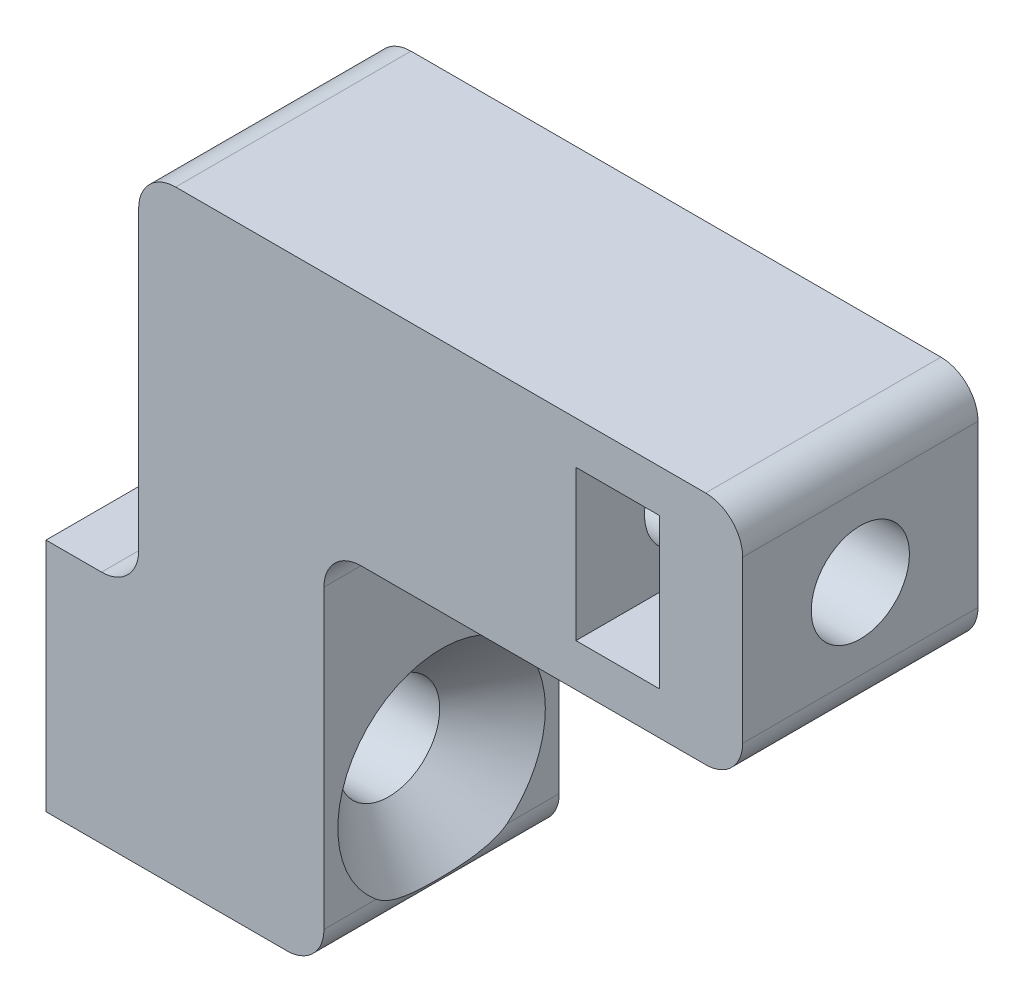
ISO-10303-21;
HEADER;
FILE_DESCRIPTION(('STEP AP214'),'2;1');
FILE_NAME('part.step','',(''),(''),'','','');
FILE_SCHEMA(('AUTOMOTIVE_DESIGN { 1 0 10303 214 1 1 1 1 }'));
ENDSEC;
DATA;
#1=APPLICATION_CONTEXT('core data for automotive mechanical design processes');
#2=APPLICATION_PROTOCOL_DEFINITION('international standard','automotive_design',2000,#1);
#3=PRODUCT_CONTEXT('',#1,'mechanical');
#4=PRODUCT('Part','Part','',(#3));
#5=PRODUCT_RELATED_PRODUCT_CATEGORY('part','',(#4));
#6=PRODUCT_DEFINITION_FORMATION('','',#4);
#7=PRODUCT_DEFINITION_CONTEXT('part definition',#1,'design');
#8=PRODUCT_DEFINITION('design','',#6,#7);
#9=PRODUCT_DEFINITION_SHAPE('','',#8);
#10=(LENGTH_UNIT() NAMED_UNIT(*) SI_UNIT(.MILLI.,.METRE.));
#11=(NAMED_UNIT(*) PLANE_ANGLE_UNIT() SI_UNIT($,.RADIAN.));
#12=(NAMED_UNIT(*) SI_UNIT($,.STERADIAN.) SOLID_ANGLE_UNIT());
#13=UNCERTAINTY_MEASURE_WITH_UNIT(LENGTH_MEASURE(1.E-05),#10,'distance_accuracy_value','');
#14=(GEOMETRIC_REPRESENTATION_CONTEXT(3) GLOBAL_UNCERTAINTY_ASSIGNED_CONTEXT((#13)) GLOBAL_UNIT_ASSIGNED_CONTEXT((#10,
#11,#12)) REPRESENTATION_CONTEXT('',''));
#15=CARTESIAN_POINT('',(0.,0.,0.));
#16=DIRECTION('',(0.,0.,1.));
#17=DIRECTION('',(1.,0.,0.));
#18=AXIS2_PLACEMENT_3D('',#15,#16,#17);
#19=CARTESIAN_POINT('',(0.,0.,12.7));
#20=DIRECTION('',(0.,0.,1.));
#21=DIRECTION('',(1.,0.,0.));
#22=AXIS2_PLACEMENT_3D('',#19,#20,#21);
#23=PLANE('',#22);
#24=DIRECTION('',(0.,1.,0.));
#25=VECTOR('',#24,1.);
#26=CARTESIAN_POINT('',(37.6,-6.35,12.7));
#27=LINE('',#26,#25);
#28=CARTESIAN_POINT('',(37.6,-4.35,12.7));
#29=VERTEX_POINT('',#28);
#30=CARTESIAN_POINT('',(37.6,4.35,12.7));
#31=VERTEX_POINT('',#30);
#32=EDGE_CURVE('E246',#29,#31,#27,.T.);
#33=ORIENTED_EDGE('',*,*,#32,.T.);
#34=CARTESIAN_POINT('',(35.6,4.35,12.7));
#35=DIRECTION('',(0.,0.,1.));
#36=DIRECTION('',(1.,0.,0.));
#37=AXIS2_PLACEMENT_3D('',#34,#35,#36);
#38=CIRCLE('',#37,2.);
#39=CARTESIAN_POINT('',(35.6,6.35,12.7));
#40=VERTEX_POINT('',#39);
#41=EDGE_CURVE('E309',#31,#40,#38,.T.);
#42=ORIENTED_EDGE('',*,*,#41,.T.);
#43=DIRECTION('',(-1.,0.,0.));
#44=VECTOR('',#43,1.);
#45=CARTESIAN_POINT('',(5.,6.35,12.7));
#46=LINE('',#45,#44);
#47=CARTESIAN_POINT('',(7.,6.35,12.7));
#48=VERTEX_POINT('',#47);
#49=EDGE_CURVE('E249',#40,#48,#46,.T.);
#50=ORIENTED_EDGE('',*,*,#49,.T.);
#51=CARTESIAN_POINT('',(7.,4.35,12.7));
#52=DIRECTION('',(0.,0.,1.));
#53=DIRECTION('',(1.,0.,0.));
#54=AXIS2_PLACEMENT_3D('',#51,#52,#53);
#55=CIRCLE('',#54,2.);
#56=CARTESIAN_POINT('',(5.,4.35,12.7));
#57=VERTEX_POINT('',#56);
#58=EDGE_CURVE('E305',#48,#57,#55,.T.);
#59=ORIENTED_EDGE('',*,*,#58,.T.);
#60=DIRECTION('',(0.,-1.,0.));
#61=VECTOR('',#60,1.);
#62=CARTESIAN_POINT('',(5.,-13.65,12.7));
#63=LINE('',#62,#61);
#64=CARTESIAN_POINT('',(5.,-11.65,12.7));
#65=VERTEX_POINT('',#64);
#66=EDGE_CURVE('E252',#57,#65,#63,.T.);
#67=ORIENTED_EDGE('',*,*,#66,.T.);
#68=CARTESIAN_POINT('',(3.,-11.65,12.7));
#69=DIRECTION('',(0.,0.,1.));
#70=DIRECTION('',(1.,0.,0.));
#71=AXIS2_PLACEMENT_3D('',#68,#69,#70);
#72=CIRCLE('',#71,2.);
#73=CARTESIAN_POINT('',(3.,-13.65,12.7));
#74=VERTEX_POINT('',#73);
#75=EDGE_CURVE('E47',#65,#74,#72,.F.);
#76=ORIENTED_EDGE('',*,*,#75,.T.);
#77=DIRECTION('',(-1.,0.,0.));
#78=VECTOR('',#77,1.);
#79=CARTESIAN_POINT('',(0.,-13.65,12.7));
#80=LINE('',#79,#78);
#81=CARTESIAN_POINT('',(0.,-13.65,12.7));
#82=VERTEX_POINT('',#81);
#83=EDGE_CURVE('E255',#74,#82,#80,.T.);
#84=ORIENTED_EDGE('',*,*,#83,.T.);
#85=DIRECTION('',(0.,-1.,0.));
#86=VECTOR('',#85,1.);
#87=CARTESIAN_POINT('',(0.,-26.35,12.7));
#88=LINE('',#87,#86);
#89=CARTESIAN_POINT('',(0.,-26.35,12.7));
#90=VERTEX_POINT('',#89);
#91=EDGE_CURVE('E257',#82,#90,#88,.T.);
#92=ORIENTED_EDGE('',*,*,#91,.T.);
#93=DIRECTION('',(1.,0.,0.));
#94=VECTOR('',#93,1.);
#95=CARTESIAN_POINT('',(0.,-26.35,12.7));
#96=LINE('',#95,#94);
#97=CARTESIAN_POINT('',(13.,-26.35,12.7));
#98=VERTEX_POINT('',#97);
#99=EDGE_CURVE('E236',#90,#98,#96,.T.);
#100=ORIENTED_EDGE('',*,*,#99,.T.);
#101=CARTESIAN_POINT('',(13.,-24.35,12.7));
#102=DIRECTION('',(0.,0.,1.));
#103=DIRECTION('',(1.,0.,0.));
#104=AXIS2_PLACEMENT_3D('',#101,#102,#103);
#105=CIRCLE('',#104,2.);
#106=CARTESIAN_POINT('',(15.,-24.35,12.7));
#107=VERTEX_POINT('',#106);
#108=EDGE_CURVE('E303',#98,#107,#105,.T.);
#109=ORIENTED_EDGE('',*,*,#108,.T.);
#110=DIRECTION('',(0.,1.,0.));
#111=VECTOR('',#110,1.);
#112=CARTESIAN_POINT('',(15.,-26.35,12.7));
#113=LINE('',#112,#111);
#114=CARTESIAN_POINT('',(15.,-8.35,12.7));
#115=VERTEX_POINT('',#114);
#116=EDGE_CURVE('E239',#107,#115,#113,.T.);
#117=ORIENTED_EDGE('',*,*,#116,.T.);
#118=CARTESIAN_POINT('',(17.,-8.35,12.7));
#119=DIRECTION('',(0.,0.,1.));
#120=DIRECTION('',(1.,0.,0.));
#121=AXIS2_PLACEMENT_3D('',#118,#119,#120);
#122=CIRCLE('',#121,2.);
#123=CARTESIAN_POINT('',(17.,-6.35,12.7));
#124=VERTEX_POINT('',#123);
#125=EDGE_CURVE('E334',#115,#124,#122,.F.);
#126=ORIENTED_EDGE('',*,*,#125,.T.);
#127=DIRECTION('',(1.,0.,0.));
#128=VECTOR('',#127,1.);
#129=CARTESIAN_POINT('',(15.,-6.35,12.7));
#130=LINE('',#129,#128);
#131=CARTESIAN_POINT('',(35.6,-6.35,12.7));
#132=VERTEX_POINT('',#131);
#133=EDGE_CURVE('E243',#124,#132,#130,.T.);
#134=ORIENTED_EDGE('',*,*,#133,.T.);
#135=CARTESIAN_POINT('',(35.6,-4.35,12.7));
#136=DIRECTION('',(0.,0.,1.));
#137=DIRECTION('',(1.,0.,0.));
#138=AXIS2_PLACEMENT_3D('',#135,#136,#137);
#139=CIRCLE('',#138,2.);
#140=EDGE_CURVE('E307',#132,#29,#139,.T.);
#141=ORIENTED_EDGE('',*,*,#140,.T.);
#142=EDGE_LOOP('',(#33,#42,#50,#59,#67,#76,#84,#92,#100,#109,#117,#126,#134,#141));
#143=FACE_BOUND('',#142,.T.);
#144=DIRECTION('',(-1.,0.,0.));
#145=VECTOR('',#144,1.);
#146=CARTESIAN_POINT('',(33.1,4.05,12.7));
#147=LINE('',#146,#145);
#148=CARTESIAN_POINT('',(33.1,4.05,12.7));
#149=VERTEX_POINT('',#148);
#150=CARTESIAN_POINT('',(28.6,4.05,12.7));
#151=VERTEX_POINT('',#150);
#152=EDGE_CURVE('E55',#149,#151,#147,.T.);
#153=ORIENTED_EDGE('',*,*,#152,.F.);
#154=DIRECTION('',(0.,-1.,0.));
#155=VECTOR('',#154,1.);
#156=CARTESIAN_POINT('',(33.1,-4.05000000000002,12.7));
#157=LINE('',#156,#155);
#158=CARTESIAN_POINT('',(33.1,-4.05000000000002,12.7));
#159=VERTEX_POINT('',#158);
#160=EDGE_CURVE('E182',#149,#159,#157,.T.);
#161=ORIENTED_EDGE('',*,*,#160,.T.);
#162=DIRECTION('',(-1.,0.,0.));
#163=VECTOR('',#162,1.);
#164=CARTESIAN_POINT('',(33.1,-4.05000000000002,12.7));
#165=LINE('',#164,#163);
#166=CARTESIAN_POINT('',(28.6,-4.05000000000002,12.7));
#167=VERTEX_POINT('',#166);
#168=EDGE_CURVE('E190',#159,#167,#165,.T.);
#169=ORIENTED_EDGE('',*,*,#168,.T.);
#170=DIRECTION('',(0.,-1.,0.));
#171=VECTOR('',#170,1.);
#172=CARTESIAN_POINT('',(28.6,-4.05000000000002,12.7));
#173=LINE('',#172,#171);
#174=EDGE_CURVE('E209',#151,#167,#173,.T.);
#175=ORIENTED_EDGE('',*,*,#174,.F.);
#176=EDGE_LOOP('',(#153,#161,#169,#175));
#177=FACE_BOUND('',#176,.T.);
#178=ADVANCED_FACE('F38',(#143,#177),#23,.T.);
#179=CARTESIAN_POINT('',(37.6,0.,6.35));
#180=DIRECTION('',(1.,0.,0.));
#181=DIRECTION('',(0.,0.,-1.));
#182=AXIS2_PLACEMENT_3D('',#179,#180,#181);
#183=CYLINDRICAL_SURFACE('',#182,2.65);
#184=CARTESIAN_POINT('',(37.6,0.,6.35));
#185=DIRECTION('',(1.,0.,0.));
#186=DIRECTION('',(0.,0.,-1.));
#187=AXIS2_PLACEMENT_3D('',#184,#185,#186);
#188=CIRCLE('',#187,2.65);
#189=CARTESIAN_POINT('',(37.6,0.,3.7));
#190=VERTEX_POINT('',#189);
#191=EDGE_CURVE('E224',#190,#190,#188,.T.);
#192=ORIENTED_EDGE('',*,*,#191,.T.);
#193=EDGE_LOOP('',(#192));
#194=FACE_BOUND('',#193,.T.);
#195=CARTESIAN_POINT('',(33.1,0.,6.35));
#196=DIRECTION('',(-1.,0.,0.));
#197=DIRECTION('',(0.,0.,1.));
#198=AXIS2_PLACEMENT_3D('',#195,#196,#197);
#199=CIRCLE('',#198,2.65);
#200=CARTESIAN_POINT('',(33.1,0.,9.));
#201=VERTEX_POINT('',#200);
#202=EDGE_CURVE('E42',#201,#201,#199,.F.);
#203=ORIENTED_EDGE('',*,*,#202,.F.);
#204=EDGE_LOOP('',(#203));
#205=FACE_BOUND('',#204,.T.);
#206=ADVANCED_FACE('F361',(#194,#205),#183,.F.);
#207=CARTESIAN_POINT('',(0.,-26.35,12.7));
#208=DIRECTION('',(0.,1.,0.));
#209=DIRECTION('',(0.,0.,1.));
#210=AXIS2_PLACEMENT_3D('',#207,#208,#209);
#211=PLANE('',#210);
#212=DIRECTION('',(1.,0.,0.));
#213=VECTOR('',#212,1.);
#214=CARTESIAN_POINT('',(0.,-26.35,0.));
#215=LINE('',#214,#213);
#216=CARTESIAN_POINT('',(0.,-26.35,0.));
#217=VERTEX_POINT('',#216);
#218=CARTESIAN_POINT('',(13.,-26.35,0.));
#219=VERTEX_POINT('',#218);
#220=EDGE_CURVE('E235',#217,#219,#215,.T.);
#221=ORIENTED_EDGE('',*,*,#220,.T.);
#222=DIRECTION('',(0.,0.,-1.));
#223=VECTOR('',#222,1.);
#224=CARTESIAN_POINT('',(13.,-26.35,12.7));
#225=LINE('',#224,#223);
#226=EDGE_CURVE('E327',#219,#98,#225,.F.);
#227=ORIENTED_EDGE('',*,*,#226,.T.);
#228=ORIENTED_EDGE('',*,*,#99,.F.);
#229=DIRECTION('',(0.,0.,-1.));
#230=VECTOR('',#229,1.);
#231=CARTESIAN_POINT('',(0.,-26.35,12.7));
#232=LINE('',#231,#230);
#233=EDGE_CURVE('E259',#90,#217,#232,.T.);
#234=ORIENTED_EDGE('',*,*,#233,.T.);
#235=EDGE_LOOP('',(#221,#227,#228,#234));
#236=FACE_BOUND('',#235,.T.);
#237=ADVANCED_FACE('F395',(#236),#211,.F.);
#238=CARTESIAN_POINT('',(15.,-26.35,12.7));
#239=DIRECTION('',(-1.,0.,0.));
#240=DIRECTION('',(0.,0.,1.));
#241=AXIS2_PLACEMENT_3D('',#238,#239,#240);
#242=PLANE('',#241);
#243=DIRECTION('',(0.,0.,-1.));
#244=VECTOR('',#243,1.);
#245=CARTESIAN_POINT('',(15.,-24.35,12.7));
#246=LINE('',#245,#244);
#247=CARTESIAN_POINT('',(15.,-24.35,9.87668399491647));
#248=VERTEX_POINT('',#247);
#249=EDGE_CURVE('E324',#107,#248,#246,.T.);
#250=ORIENTED_EDGE('',*,*,#249,.T.);
#251=CARTESIAN_POINT('',(15.,-20.,6.35));
#252=DIRECTION('',(1.,0.,0.));
#253=DIRECTION('',(0.,0.,-1.));
#254=AXIS2_PLACEMENT_3D('',#251,#252,#253);
#255=CIRCLE('',#254,5.6);
#256=CARTESIAN_POINT('',(15.,-24.35,2.82331600508352));
#257=VERTEX_POINT('',#256);
#258=EDGE_CURVE('E61',#257,#248,#255,.T.);
#259=ORIENTED_EDGE('',*,*,#258,.F.);
#260=CARTESIAN_POINT('',(15.,-24.35,0.));
#261=VERTEX_POINT('',#260);
#262=EDGE_CURVE('E323',#257,#261,#246,.T.);
#263=ORIENTED_EDGE('',*,*,#262,.T.);
#264=DIRECTION('',(0.,1.,0.));
#265=VECTOR('',#264,1.);
#266=CARTESIAN_POINT('',(15.,-26.35,0.));
#267=LINE('',#266,#265);
#268=CARTESIAN_POINT('',(15.,-8.35,0.));
#269=VERTEX_POINT('',#268);
#270=EDGE_CURVE('E262',#261,#269,#267,.T.);
#271=ORIENTED_EDGE('',*,*,#270,.T.);
#272=DIRECTION('',(0.,0.,-1.));
#273=VECTOR('',#272,1.);
#274=CARTESIAN_POINT('',(15.,-8.35,12.7));
#275=LINE('',#274,#273);
#276=EDGE_CURVE('E321',#269,#115,#275,.F.);
#277=ORIENTED_EDGE('',*,*,#276,.T.);
#278=ORIENTED_EDGE('',*,*,#116,.F.);
#279=EDGE_LOOP('',(#250,#259,#263,#271,#277,#278));
#280=FACE_BOUND('',#279,.T.);
#281=ADVANCED_FACE('F391',(#280),#242,.F.);
#282=CARTESIAN_POINT('',(15.,-6.35,12.7));
#283=DIRECTION('',(0.,1.,0.));
#284=DIRECTION('',(0.,0.,1.));
#285=AXIS2_PLACEMENT_3D('',#282,#283,#284);
#286=PLANE('',#285);
#287=DIRECTION('',(1.,0.,0.));
#288=VECTOR('',#287,1.);
#289=CARTESIAN_POINT('',(15.,-6.35,0.));
#290=LINE('',#289,#288);
#291=CARTESIAN_POINT('',(17.,-6.35,0.));
#292=VERTEX_POINT('',#291);
#293=CARTESIAN_POINT('',(35.6,-6.35,0.));
#294=VERTEX_POINT('',#293);
#295=EDGE_CURVE('E265',#292,#294,#290,.T.);
#296=ORIENTED_EDGE('',*,*,#295,.T.);
#297=DIRECTION('',(0.,0.,-1.));
#298=VECTOR('',#297,1.);
#299=CARTESIAN_POINT('',(35.6,-6.35,12.7));
#300=LINE('',#299,#298);
#301=EDGE_CURVE('E314',#294,#132,#300,.F.);
#302=ORIENTED_EDGE('',*,*,#301,.T.);
#303=ORIENTED_EDGE('',*,*,#133,.F.);
#304=DIRECTION('',(0.,0.,-1.));
#305=VECTOR('',#304,1.);
#306=CARTESIAN_POINT('',(17.,-6.35,0.));
#307=LINE('',#306,#305);
#308=EDGE_CURVE('E311',#124,#292,#307,.T.);
#309=ORIENTED_EDGE('',*,*,#308,.T.);
#310=EDGE_LOOP('',(#296,#302,#303,#309));
#311=FACE_BOUND('',#310,.T.);
#312=ADVANCED_FACE('F387',(#311),#286,.F.);
#313=CARTESIAN_POINT('',(37.6,-6.35,12.7));
#314=DIRECTION('',(-1.,0.,0.));
#315=DIRECTION('',(0.,0.,1.));
#316=AXIS2_PLACEMENT_3D('',#313,#314,#315);
#317=PLANE('',#316);
#318=ORIENTED_EDGE('',*,*,#191,.F.);
#319=EDGE_LOOP('',(#318));
#320=FACE_BOUND('',#319,.T.);
#321=DIRECTION('',(0.,1.,0.));
#322=VECTOR('',#321,1.);
#323=CARTESIAN_POINT('',(37.6,-6.35,0.));
#324=LINE('',#323,#322);
#325=CARTESIAN_POINT('',(37.6,-4.35,0.));
#326=VERTEX_POINT('',#325);
#327=CARTESIAN_POINT('',(37.6,4.35,0.));
#328=VERTEX_POINT('',#327);
#329=EDGE_CURVE('E268',#326,#328,#324,.T.);
#330=ORIENTED_EDGE('',*,*,#329,.T.);
#331=DIRECTION('',(0.,0.,-1.));
#332=VECTOR('',#331,1.);
#333=CARTESIAN_POINT('',(37.6,4.35,12.7));
#334=LINE('',#333,#332);
#335=EDGE_CURVE('E301',#328,#31,#334,.F.);
#336=ORIENTED_EDGE('',*,*,#335,.T.);
#337=ORIENTED_EDGE('',*,*,#32,.F.);
#338=DIRECTION('',(0.,0.,-1.));
#339=VECTOR('',#338,1.);
#340=CARTESIAN_POINT('',(37.6,-4.35,12.7));
#341=LINE('',#340,#339);
#342=EDGE_CURVE('E298',#29,#326,#341,.T.);
#343=ORIENTED_EDGE('',*,*,#342,.T.);
#344=EDGE_LOOP('',(#330,#336,#337,#343));
#345=FACE_BOUND('',#344,.T.);
#346=ADVANCED_FACE('F383',(#320,#345),#317,.F.);
#347=CARTESIAN_POINT('',(5.,6.35,12.7));
#348=DIRECTION('',(0.,-1.,0.));
#349=DIRECTION('',(0.,0.,-1.));
#350=AXIS2_PLACEMENT_3D('',#347,#348,#349);
#351=PLANE('',#350);
#352=ORIENTED_EDGE('',*,*,#49,.F.);
#353=DIRECTION('',(0.,0.,-1.));
#354=VECTOR('',#353,1.);
#355=CARTESIAN_POINT('',(35.6,6.35,12.7));
#356=LINE('',#355,#354);
#357=CARTESIAN_POINT('',(35.6,6.35,0.));
#358=VERTEX_POINT('',#357);
#359=EDGE_CURVE('E287',#40,#358,#356,.T.);
#360=ORIENTED_EDGE('',*,*,#359,.T.);
#361=DIRECTION('',(-1.,0.,0.));
#362=VECTOR('',#361,1.);
#363=CARTESIAN_POINT('',(5.,6.35,0.));
#364=LINE('',#363,#362);
#365=CARTESIAN_POINT('',(7.,6.35,0.));
#366=VERTEX_POINT('',#365);
#367=EDGE_CURVE('E271',#358,#366,#364,.T.);
#368=ORIENTED_EDGE('',*,*,#367,.T.);
#369=DIRECTION('',(0.,0.,-1.));
#370=VECTOR('',#369,1.);
#371=CARTESIAN_POINT('',(7.,6.35,12.7));
#372=LINE('',#371,#370);
#373=EDGE_CURVE('E285',#366,#48,#372,.F.);
#374=ORIENTED_EDGE('',*,*,#373,.T.);
#375=EDGE_LOOP('',(#352,#360,#368,#374));
#376=FACE_BOUND('',#375,.T.);
#377=ADVANCED_FACE('F379',(#376),#351,.F.);
#378=CARTESIAN_POINT('',(5.,-13.65,12.7));
#379=DIRECTION('',(1.,0.,0.));
#380=DIRECTION('',(0.,0.,-1.));
#381=AXIS2_PLACEMENT_3D('',#378,#379,#380);
#382=PLANE('',#381);
#383=CARTESIAN_POINT('',(5.,0.,6.35));
#384=DIRECTION('',(1.,0.,0.));
#385=DIRECTION('',(0.,0.,-1.));
#386=AXIS2_PLACEMENT_3D('',#383,#384,#385);
#387=CIRCLE('',#386,2.65);
#388=CARTESIAN_POINT('',(5.,0.,3.7));
#389=VERTEX_POINT('',#388);
#390=EDGE_CURVE('E227',#389,#389,#387,.T.);
#391=ORIENTED_EDGE('',*,*,#390,.T.);
#392=EDGE_LOOP('',(#391));
#393=FACE_BOUND('',#392,.T.);
#394=ORIENTED_EDGE('',*,*,#66,.F.);
#395=DIRECTION('',(0.,0.,-1.));
#396=VECTOR('',#395,1.);
#397=CARTESIAN_POINT('',(5.,4.35,12.7));
#398=LINE('',#397,#396);
#399=CARTESIAN_POINT('',(5.,4.35,0.));
#400=VERTEX_POINT('',#399);
#401=EDGE_CURVE('E318',#57,#400,#398,.T.);
#402=ORIENTED_EDGE('',*,*,#401,.T.);
#403=DIRECTION('',(0.,-1.,0.));
#404=VECTOR('',#403,1.);
#405=CARTESIAN_POINT('',(5.,-13.65,0.));
#406=LINE('',#405,#404);
#407=CARTESIAN_POINT('',(5.,-11.65,0.));
#408=VERTEX_POINT('',#407);
#409=EDGE_CURVE('E274',#400,#408,#406,.T.);
#410=ORIENTED_EDGE('',*,*,#409,.T.);
#411=DIRECTION('',(0.,0.,-1.));
#412=VECTOR('',#411,1.);
#413=CARTESIAN_POINT('',(5.,-11.65,12.7));
#414=LINE('',#413,#412);
#415=EDGE_CURVE('E316',#408,#65,#414,.F.);
#416=ORIENTED_EDGE('',*,*,#415,.T.);
#417=EDGE_LOOP('',(#394,#402,#410,#416));
#418=FACE_BOUND('',#417,.T.);
#419=ADVANCED_FACE('F375',(#393,#418),#382,.F.);
#420=CARTESIAN_POINT('',(0.,-13.65,12.7));
#421=DIRECTION('',(0.,-1.,0.));
#422=DIRECTION('',(0.,0.,-1.));
#423=AXIS2_PLACEMENT_3D('',#420,#421,#422);
#424=PLANE('',#423);
#425=ORIENTED_EDGE('',*,*,#83,.F.);
#426=DIRECTION('',(0.,0.,-1.));
#427=VECTOR('',#426,1.);
#428=CARTESIAN_POINT('',(3.,-13.65,0.));
#429=LINE('',#428,#427);
#430=CARTESIAN_POINT('',(3.,-13.65,0.));
#431=VERTEX_POINT('',#430);
#432=EDGE_CURVE('E329',#74,#431,#429,.T.);
#433=ORIENTED_EDGE('',*,*,#432,.T.);
#434=DIRECTION('',(-1.,0.,0.));
#435=VECTOR('',#434,1.);
#436=CARTESIAN_POINT('',(0.,-13.65,0.));
#437=LINE('',#436,#435);
#438=CARTESIAN_POINT('',(0.,-13.65,0.));
#439=VERTEX_POINT('',#438);
#440=EDGE_CURVE('E277',#431,#439,#437,.T.);
#441=ORIENTED_EDGE('',*,*,#440,.T.);
#442=DIRECTION('',(0.,0.,-1.));
#443=VECTOR('',#442,1.);
#444=CARTESIAN_POINT('',(0.,-13.65,12.7));
#445=LINE('',#444,#443);
#446=EDGE_CURVE('E282',#82,#439,#445,.T.);
#447=ORIENTED_EDGE('',*,*,#446,.F.);
#448=EDGE_LOOP('',(#425,#433,#441,#447));
#449=FACE_BOUND('',#448,.T.);
#450=ADVANCED_FACE('F371',(#449),#424,.F.);
#451=CARTESIAN_POINT('',(0.,-26.35,12.7));
#452=DIRECTION('',(1.,0.,0.));
#453=DIRECTION('',(0.,0.,-1.));
#454=AXIS2_PLACEMENT_3D('',#451,#452,#453);
#455=PLANE('',#454);
#456=CARTESIAN_POINT('',(0.,-20.,6.35));
#457=DIRECTION('',(1.,0.,0.));
#458=DIRECTION('',(0.,0.,-1.));
#459=AXIS2_PLACEMENT_3D('',#456,#457,#458);
#460=CIRCLE('',#459,2.75);
#461=CARTESIAN_POINT('',(0.,-20.,3.6));
#462=VERTEX_POINT('',#461);
#463=EDGE_CURVE('E232',#462,#462,#460,.T.);
#464=ORIENTED_EDGE('',*,*,#463,.T.);
#465=EDGE_LOOP('',(#464));
#466=FACE_BOUND('',#465,.T.);
#467=DIRECTION('',(0.,-1.,0.));
#468=VECTOR('',#467,1.);
#469=CARTESIAN_POINT('',(0.,-26.35,0.));
#470=LINE('',#469,#468);
#471=EDGE_CURVE('E240',#439,#217,#470,.T.);
#472=ORIENTED_EDGE('',*,*,#471,.T.);
#473=ORIENTED_EDGE('',*,*,#233,.F.);
#474=ORIENTED_EDGE('',*,*,#91,.F.);
#475=ORIENTED_EDGE('',*,*,#446,.T.);
#476=EDGE_LOOP('',(#472,#473,#474,#475));
#477=FACE_BOUND('',#476,.T.);
#478=ADVANCED_FACE('F367',(#466,#477),#455,.F.);
#479=CARTESIAN_POINT('',(0.,0.,0.));
#480=DIRECTION('',(0.,0.,1.));
#481=DIRECTION('',(1.,0.,0.));
#482=AXIS2_PLACEMENT_3D('',#479,#480,#481);
#483=PLANE('',#482);
#484=ORIENTED_EDGE('',*,*,#367,.F.);
#485=CARTESIAN_POINT('',(35.6,4.35,0.));
#486=DIRECTION('',(0.,0.,1.));
#487=DIRECTION('',(1.,0.,0.));
#488=AXIS2_PLACEMENT_3D('',#485,#486,#487);
#489=CIRCLE('',#488,2.);
#490=EDGE_CURVE('E296',#358,#328,#489,.F.);
#491=ORIENTED_EDGE('',*,*,#490,.T.);
#492=ORIENTED_EDGE('',*,*,#329,.F.);
#493=CARTESIAN_POINT('',(35.6,-4.35,0.));
#494=DIRECTION('',(0.,0.,1.));
#495=DIRECTION('',(1.,0.,0.));
#496=AXIS2_PLACEMENT_3D('',#493,#494,#495);
#497=CIRCLE('',#496,2.);
#498=EDGE_CURVE('E294',#326,#294,#497,.F.);
#499=ORIENTED_EDGE('',*,*,#498,.T.);
#500=ORIENTED_EDGE('',*,*,#295,.F.);
#501=CARTESIAN_POINT('',(17.,-8.35,0.));
#502=DIRECTION('',(0.,0.,1.));
#503=DIRECTION('',(1.,0.,0.));
#504=AXIS2_PLACEMENT_3D('',#501,#502,#503);
#505=CIRCLE('',#504,2.);
#506=EDGE_CURVE('E332',#292,#269,#505,.T.);
#507=ORIENTED_EDGE('',*,*,#506,.T.);
#508=ORIENTED_EDGE('',*,*,#270,.F.);
#509=CARTESIAN_POINT('',(13.,-24.35,0.));
#510=DIRECTION('',(0.,0.,1.));
#511=DIRECTION('',(1.,0.,0.));
#512=AXIS2_PLACEMENT_3D('',#509,#510,#511);
#513=CIRCLE('',#512,2.);
#514=EDGE_CURVE('E290',#261,#219,#513,.F.);
#515=ORIENTED_EDGE('',*,*,#514,.T.);
#516=ORIENTED_EDGE('',*,*,#220,.F.);
#517=ORIENTED_EDGE('',*,*,#471,.F.);
#518=ORIENTED_EDGE('',*,*,#440,.F.);
#519=CARTESIAN_POINT('',(3.,-11.65,0.));
#520=DIRECTION('',(0.,0.,1.));
#521=DIRECTION('',(1.,0.,0.));
#522=AXIS2_PLACEMENT_3D('',#519,#520,#521);
#523=CIRCLE('',#522,2.);
#524=EDGE_CURVE('E336',#431,#408,#523,.T.);
#525=ORIENTED_EDGE('',*,*,#524,.T.);
#526=ORIENTED_EDGE('',*,*,#409,.F.);
#527=CARTESIAN_POINT('',(7.,4.35,0.));
#528=DIRECTION('',(0.,0.,1.));
#529=DIRECTION('',(1.,0.,0.));
#530=AXIS2_PLACEMENT_3D('',#527,#528,#529);
#531=CIRCLE('',#530,2.);
#532=EDGE_CURVE('E292',#400,#366,#531,.F.);
#533=ORIENTED_EDGE('',*,*,#532,.T.);
#534=EDGE_LOOP('',(#484,#491,#492,#499,#500,#507,#508,#515,#516,#517,#518,#525,#526,#533));
#535=FACE_BOUND('',#534,.T.);
#536=ADVANCED_FACE('F363',(#535),#483,.F.);
#537=CARTESIAN_POINT('',(35.6,4.35,12.7));
#538=DIRECTION('',(0.,0.,-1.));
#539=DIRECTION('',(-1.,0.,0.));
#540=AXIS2_PLACEMENT_3D('',#537,#538,#539);
#541=CYLINDRICAL_SURFACE('',#540,2.);
#542=ORIENTED_EDGE('',*,*,#41,.F.);
#543=ORIENTED_EDGE('',*,*,#335,.F.);
#544=ORIENTED_EDGE('',*,*,#490,.F.);
#545=ORIENTED_EDGE('',*,*,#359,.F.);
#546=EDGE_LOOP('',(#542,#543,#544,#545));
#547=FACE_BOUND('',#546,.T.);
#548=ADVANCED_FACE('F366',(#547),#541,.T.);
#549=CARTESIAN_POINT('',(35.6,-4.35,12.7));
#550=DIRECTION('',(0.,0.,-1.));
#551=DIRECTION('',(-1.,0.,0.));
#552=AXIS2_PLACEMENT_3D('',#549,#550,#551);
#553=CYLINDRICAL_SURFACE('',#552,2.);
#554=ORIENTED_EDGE('',*,*,#140,.F.);
#555=ORIENTED_EDGE('',*,*,#301,.F.);
#556=ORIENTED_EDGE('',*,*,#498,.F.);
#557=ORIENTED_EDGE('',*,*,#342,.F.);
#558=EDGE_LOOP('',(#554,#555,#556,#557));
#559=FACE_BOUND('',#558,.T.);
#560=ADVANCED_FACE('F402',(#559),#553,.T.);
#561=CARTESIAN_POINT('',(7.,4.35,12.7));
#562=DIRECTION('',(0.,0.,-1.));
#563=DIRECTION('',(-1.,0.,0.));
#564=AXIS2_PLACEMENT_3D('',#561,#562,#563);
#565=CYLINDRICAL_SURFACE('',#564,2.);
#566=ORIENTED_EDGE('',*,*,#58,.F.);
#567=ORIENTED_EDGE('',*,*,#373,.F.);
#568=ORIENTED_EDGE('',*,*,#532,.F.);
#569=ORIENTED_EDGE('',*,*,#401,.F.);
#570=EDGE_LOOP('',(#566,#567,#568,#569));
#571=FACE_BOUND('',#570,.T.);
#572=ADVANCED_FACE('F405',(#571),#565,.T.);
#573=CARTESIAN_POINT('',(13.,-24.35,12.7));
#574=DIRECTION('',(0.,0.,-1.));
#575=DIRECTION('',(-1.,0.,0.));
#576=AXIS2_PLACEMENT_3D('',#573,#574,#575);
#577=CYLINDRICAL_SURFACE('',#576,2.);
#578=CARTESIAN_POINT('',(14.9960773932891,-24.2247999999997,10.0197611845574));
#579=CARTESIAN_POINT('',(14.9979296053689,-24.2544070267147,9.98850208575414));
#580=CARTESIAN_POINT('',(14.9990761111504,-24.283143965233,9.95640936006576));
#581=CARTESIAN_POINT('',(15.0001648315078,-24.3389337734214,9.89081199967459));
#582=CARTESIAN_POINT('',(15.0001079814407,-24.3659879346928,9.85730848178313));
#583=CARTESIAN_POINT('',(14.9984491950385,-24.4445796744331,9.75524557024236));
#584=CARTESIAN_POINT('',(14.995369788484,-24.4937677325432,9.68489546824695));
#585=CARTESIAN_POINT('',(14.9865694709556,-24.585916455606,9.54159680797546));
#586=CARTESIAN_POINT('',(14.9808793225489,-24.628942189149,9.46868740157441));
#587=CARTESIAN_POINT('',(14.9677503151277,-24.7100601375656,9.32023519195759));
#588=CARTESIAN_POINT('',(14.9603093569483,-24.7481463444049,9.24468932103806));
#589=CARTESIAN_POINT('',(14.9384246434154,-24.8466440032624,9.03436566813787));
#590=CARTESIAN_POINT('',(14.9229053053298,-24.9024515338911,8.89754104142713));
#591=CARTESIAN_POINT('',(14.891320052976,-25.0024073392095,8.61981621706785));
#592=CARTESIAN_POINT('',(14.87525398207,-25.0465522402893,8.47891485320393));
#593=CARTESIAN_POINT('',(14.8442517619402,-25.1249358252931,8.19304152568853));
#594=CARTESIAN_POINT('',(14.8293257805739,-25.159091667507,8.04804588449118));
#595=CARTESIAN_POINT('',(14.802092433892,-25.2180492780525,7.75591389892042));
#596=CARTESIAN_POINT('',(14.7897856588641,-25.2428489387627,7.60877707995768));
#597=CARTESIAN_POINT('',(14.7649965732759,-25.2911642876035,7.25980872796258));
#598=CARTESIAN_POINT('',(14.754044955306,-25.3110060734173,7.05734970200278));
#599=CARTESIAN_POINT('',(14.7402981662029,-25.3356747285105,6.65119514439536));
#600=CARTESIAN_POINT('',(14.7375057395017,-25.3404965456973,6.44749921978422));
#601=CARTESIAN_POINT('',(14.7404340548539,-25.3353411979036,6.04063574859547));
#602=CARTESIAN_POINT('',(14.7461432053713,-25.325384183287,5.83746786023742));
#603=CARTESIAN_POINT('',(14.7653204744371,-25.2902417768863,5.43286796765554));
#604=CARTESIAN_POINT('',(14.7787855437907,-25.2650623695056,5.23143531280349));
#605=CARTESIAN_POINT('',(14.8049715974049,-25.2117144332155,4.91255357026291));
#606=CARTESIAN_POINT('',(14.815797444733,-25.1888586619362,4.79403686637621));
#607=CARTESIAN_POINT('',(14.8389384631845,-25.1368428610788,4.55854925262909));
#608=CARTESIAN_POINT('',(14.8512533520116,-25.1076840256282,4.4415780544177));
#609=CARTESIAN_POINT('',(14.8765537512882,-25.0426449836832,4.21023847215803));
#610=CARTESIAN_POINT('',(14.8895354937747,-25.0068000567642,4.09585980768693));
#611=CARTESIAN_POINT('',(14.9152528543182,-24.9275360504492,3.86976243996257));
#612=CARTESIAN_POINT('',(14.9279885983872,-24.8841209696355,3.7580423676606));
#613=CARTESIAN_POINT('',(14.9494331255905,-24.7985829679125,3.56096056134726));
#614=CARTESIAN_POINT('',(14.9584292023752,-24.7580605145746,3.4749388825264));
#615=CARTESIAN_POINT('',(14.9745660651352,-24.6710130203571,3.30592639088691));
#616=CARTESIAN_POINT('',(14.9817093101643,-24.6244960593912,3.22293168781297));
#617=CARTESIAN_POINT('',(14.9930670121184,-24.5240055706524,3.05986137749699));
#618=CARTESIAN_POINT('',(14.9972444708714,-24.4699475815225,2.97983406111121));
#619=CARTESIAN_POINT('',(14.9999415982008,-24.3828428401463,2.86397307270978));
#620=CARTESIAN_POINT('',(15.000242470893,-24.3527314456476,2.82596979303561));
#621=CARTESIAN_POINT('',(14.9993530158201,-24.2903832714011,2.75170565213901));
#622=CARTESIAN_POINT('',(14.998161148132,-24.2581443293796,2.7154466304012));
#623=CARTESIAN_POINT('',(14.9960773932891,-24.2248,2.6802388154429));
#624=B_SPLINE_CURVE_WITH_KNOTS('',3,(#578,#579,#580,#581,#582,#583,#584,#585,#586,#587,#588,
#589,#590,#591,#592,#593,#594,#595,#596,#597,#598,#599,#600,#601,#602,#603,#604,#605,#606,#607,
#608,#609,#610,#611,#612,#613,#614,#615,#616,#617,#618,#619,#620,#621,#622,#623),.UNSPECIFIED.,
.F.,.F.,(4,2,2,2,2,2,2,2,2,2,2,2,2,2,2,2,2,2,2,2,2,2,4),(0.,0.129224378416605,0.258348315658723,
0.515625291487693,0.769945667507748,1.02457253340531,1.46961487225617,1.91478580641616,
2.36355025962518,2.81241574354178,3.42281735595257,4.03342425990787,4.6431993894465,
5.25273495286378,5.61613649677277,5.97946925382094,6.34093647993012,6.70221335295849,
6.98854039324228,7.27448545685453,7.56393782330224,7.70931032934326,7.8548329264249),.UNSPECIFIED.);
#625=EDGE_CURVE('E12',#248,#257,#624,.T.);
#626=ORIENTED_EDGE('',*,*,#625,.F.);
#627=ORIENTED_EDGE('',*,*,#249,.F.);
#628=ORIENTED_EDGE('',*,*,#108,.F.);
#629=ORIENTED_EDGE('',*,*,#226,.F.);
#630=ORIENTED_EDGE('',*,*,#514,.F.);
#631=ORIENTED_EDGE('',*,*,#262,.F.);
#632=EDGE_LOOP('',(#626,#627,#628,#629,#630,#631));
#633=FACE_BOUND('',#632,.T.);
#634=ADVANCED_FACE('F345',(#633),#577,.T.);
#635=CARTESIAN_POINT('',(17.,-8.35,12.7));
#636=DIRECTION('',(0.,0.,1.));
#637=DIRECTION('',(1.,0.,0.));
#638=AXIS2_PLACEMENT_3D('',#635,#636,#637);
#639=CYLINDRICAL_SURFACE('',#638,2.);
#640=ORIENTED_EDGE('',*,*,#125,.F.);
#641=ORIENTED_EDGE('',*,*,#276,.F.);
#642=ORIENTED_EDGE('',*,*,#506,.F.);
#643=ORIENTED_EDGE('',*,*,#308,.F.);
#644=EDGE_LOOP('',(#640,#641,#642,#643));
#645=FACE_BOUND('',#644,.T.);
#646=ADVANCED_FACE('F412',(#645),#639,.F.);
#647=CARTESIAN_POINT('',(3.,-11.65,12.7));
#648=DIRECTION('',(0.,0.,1.));
#649=DIRECTION('',(1.,0.,0.));
#650=AXIS2_PLACEMENT_3D('',#647,#648,#649);
#651=CYLINDRICAL_SURFACE('',#650,2.);
#652=ORIENTED_EDGE('',*,*,#75,.F.);
#653=ORIENTED_EDGE('',*,*,#415,.F.);
#654=ORIENTED_EDGE('',*,*,#524,.F.);
#655=ORIENTED_EDGE('',*,*,#432,.F.);
#656=EDGE_LOOP('',(#652,#653,#654,#655));
#657=FACE_BOUND('',#656,.T.);
#658=ADVANCED_FACE('F40',(#657),#651,.F.);
#659=CARTESIAN_POINT('',(15.,-20.,6.35));
#660=DIRECTION('',(1.,0.,0.));
#661=DIRECTION('',(0.,0.,-1.));
#662=AXIS2_PLACEMENT_3D('',#659,#660,#661);
#663=CYLINDRICAL_SURFACE('',#662,2.75);
#664=ORIENTED_EDGE('',*,*,#463,.F.);
#665=EDGE_LOOP('',(#664));
#666=FACE_BOUND('',#665,.T.);
#667=CARTESIAN_POINT('',(12.15,-20.,6.35));
#668=DIRECTION('',(1.,0.,0.));
#669=DIRECTION('',(0.,0.,-1.));
#670=AXIS2_PLACEMENT_3D('',#667,#668,#669);
#671=CIRCLE('',#670,2.75);
#672=CARTESIAN_POINT('',(12.15,-20.,3.6));
#673=VERTEX_POINT('',#672);
#674=EDGE_CURVE('E229',#673,#673,#671,.T.);
#675=ORIENTED_EDGE('',*,*,#674,.T.);
#676=EDGE_LOOP('',(#675));
#677=FACE_BOUND('',#676,.T.);
#678=ADVANCED_FACE('F354',(#666,#677),#663,.F.);
#679=CARTESIAN_POINT('',(15.,-20.,6.35));
#680=DIRECTION('',(1.,0.,0.));
#681=DIRECTION('',(0.,0.,-1.));
#682=AXIS2_PLACEMENT_3D('',#679,#680,#681);
#683=CONICAL_SURFACE('',#682,5.6,0.785398163397448);
#684=ORIENTED_EDGE('',*,*,#625,.T.);
#685=ORIENTED_EDGE('',*,*,#258,.T.);
#686=EDGE_LOOP('',(#684,#685));
#687=FACE_BOUND('',#686,.T.);
#688=ORIENTED_EDGE('',*,*,#674,.F.);
#689=EDGE_LOOP('',(#688));
#690=FACE_BOUND('',#689,.T.);
#691=ADVANCED_FACE('F348',(#687,#690),#683,.F.);
#692=CARTESIAN_POINT('',(28.6,0.,6.35));
#693=DIRECTION('',(-1.,0.,0.));
#694=DIRECTION('',(0.,0.,1.));
#695=AXIS2_PLACEMENT_3D('',#692,#693,#694);
#696=CIRCLE('',#695,2.65);
#697=CARTESIAN_POINT('',(28.6,0.,9.));
#698=VERTEX_POINT('',#697);
#699=EDGE_CURVE('E196',#698,#698,#696,.F.);
#700=ORIENTED_EDGE('',*,*,#699,.T.);
#701=EDGE_LOOP('',(#700));
#702=FACE_BOUND('',#701,.T.);
#703=ORIENTED_EDGE('',*,*,#390,.F.);
#704=EDGE_LOOP('',(#703));
#705=FACE_BOUND('',#704,.T.);
#706=ADVANCED_FACE('F353',(#702,#705),#183,.F.);
#707=CARTESIAN_POINT('',(33.1,0.,0.));
#708=DIRECTION('',(-1.,0.,0.));
#709=DIRECTION('',(0.,0.,1.));
#710=AXIS2_PLACEMENT_3D('',#707,#708,#709);
#711=PLANE('',#710);
#712=ORIENTED_EDGE('',*,*,#160,.F.);
#713=DIRECTION('',(0.,0.,1.));
#714=VECTOR('',#713,1.);
#715=CARTESIAN_POINT('',(33.1,4.05,6.35));
#716=LINE('',#715,#714);
#717=CARTESIAN_POINT('',(33.1,4.05,4.01173140978201));
#718=VERTEX_POINT('',#717);
#719=EDGE_CURVE('E207',#718,#149,#716,.T.);
#720=ORIENTED_EDGE('',*,*,#719,.F.);
#721=DIRECTION('',(0.,0.86602540378444,0.499999999999998));
#722=VECTOR('',#721,1.);
#723=CARTESIAN_POINT('',(33.1,4.05,4.01173140978201));
#724=LINE('',#723,#722);
#725=CARTESIAN_POINT('',(33.1,0.,1.67346281956403));
#726=VERTEX_POINT('',#725);
#727=EDGE_CURVE('E205',#726,#718,#724,.T.);
#728=ORIENTED_EDGE('',*,*,#727,.F.);
#729=DIRECTION('',(0.,0.866025403784436,-0.500000000000004));
#730=VECTOR('',#729,1.);
#731=CARTESIAN_POINT('',(33.1,0.,1.67346281956403));
#732=LINE('',#731,#730);
#733=CARTESIAN_POINT('',(33.1,-4.05000000000001,4.01173140978204));
#734=VERTEX_POINT('',#733);
#735=EDGE_CURVE('E184',#734,#726,#732,.T.);
#736=ORIENTED_EDGE('',*,*,#735,.F.);
#737=DIRECTION('',(0.,0.,-1.));
#738=VECTOR('',#737,1.);
#739=CARTESIAN_POINT('',(33.1,-4.05000000000001,6.35000000000003));
#740=LINE('',#739,#738);
#741=EDGE_CURVE('E176',#159,#734,#740,.T.);
#742=ORIENTED_EDGE('',*,*,#741,.F.);
#743=EDGE_LOOP('',(#712,#720,#728,#736,#742));
#744=FACE_BOUND('',#743,.T.);
#745=ORIENTED_EDGE('',*,*,#202,.T.);
#746=EDGE_LOOP('',(#745));
#747=FACE_BOUND('',#746,.T.);
#748=ADVANCED_FACE('F178',(#744,#747),#711,.T.);
#749=CARTESIAN_POINT('',(28.6,0.,0.));
#750=DIRECTION('',(-1.,0.,0.));
#751=DIRECTION('',(0.,0.,1.));
#752=AXIS2_PLACEMENT_3D('',#749,#750,#751);
#753=PLANE('',#752);
#754=ORIENTED_EDGE('',*,*,#174,.T.);
#755=DIRECTION('',(0.,0.,-1.));
#756=VECTOR('',#755,1.);
#757=CARTESIAN_POINT('',(28.6,-4.05000000000001,4.01173140978204));
#758=LINE('',#757,#756);
#759=CARTESIAN_POINT('',(28.6,-4.05000000000001,4.01173140978204));
#760=VERTEX_POINT('',#759);
#761=EDGE_CURVE('E192',#167,#760,#758,.T.);
#762=ORIENTED_EDGE('',*,*,#761,.T.);
#763=DIRECTION('',(0.,0.866025403784436,-0.500000000000004));
#764=VECTOR('',#763,1.);
#765=CARTESIAN_POINT('',(28.6,0.,1.67346281956403));
#766=LINE('',#765,#764);
#767=CARTESIAN_POINT('',(28.6,0.,1.67346281956403));
#768=VERTEX_POINT('',#767);
#769=EDGE_CURVE('E212',#760,#768,#766,.T.);
#770=ORIENTED_EDGE('',*,*,#769,.T.);
#771=DIRECTION('',(0.,0.86602540378444,0.499999999999998));
#772=VECTOR('',#771,1.);
#773=CARTESIAN_POINT('',(28.6,4.05,4.01173140978201));
#774=LINE('',#773,#772);
#775=CARTESIAN_POINT('',(28.6,4.05,4.01173140978201));
#776=VERTEX_POINT('',#775);
#777=EDGE_CURVE('E201',#768,#776,#774,.T.);
#778=ORIENTED_EDGE('',*,*,#777,.T.);
#779=DIRECTION('',(0.,0.,1.));
#780=VECTOR('',#779,1.);
#781=CARTESIAN_POINT('',(28.6,4.05,12.7));
#782=LINE('',#781,#780);
#783=EDGE_CURVE('E199',#776,#151,#782,.T.);
#784=ORIENTED_EDGE('',*,*,#783,.T.);
#785=EDGE_LOOP('',(#754,#762,#770,#778,#784));
#786=FACE_BOUND('',#785,.T.);
#787=ORIENTED_EDGE('',*,*,#699,.F.);
#788=EDGE_LOOP('',(#787));
#789=FACE_BOUND('',#788,.T.);
#790=ADVANCED_FACE('F487',(#786,#789),#753,.F.);
#791=CARTESIAN_POINT('',(33.1,-4.05000000000001,4.01173140978204));
#792=DIRECTION('',(0.,1.,0.));
#793=DIRECTION('',(0.,0.,1.));
#794=AXIS2_PLACEMENT_3D('',#791,#792,#793);
#795=PLANE('',#794);
#796=ORIENTED_EDGE('',*,*,#761,.F.);
#797=ORIENTED_EDGE('',*,*,#168,.F.);
#798=ORIENTED_EDGE('',*,*,#741,.T.);
#799=DIRECTION('',(-1.,0.,0.));
#800=VECTOR('',#799,1.);
#801=CARTESIAN_POINT('',(33.1,-4.05000000000001,4.01173140978204));
#802=LINE('',#801,#800);
#803=EDGE_CURVE('E197',#734,#760,#802,.T.);
#804=ORIENTED_EDGE('',*,*,#803,.T.);
#805=EDGE_LOOP('',(#796,#797,#798,#804));
#806=FACE_BOUND('',#805,.T.);
#807=ADVANCED_FACE('F191',(#806),#795,.T.);
#808=CARTESIAN_POINT('',(33.1,0.,1.67346281956403));
#809=DIRECTION('',(0.,0.500000000000004,0.866025403784436));
#810=DIRECTION('',(0.,-0.866025403784436,0.500000000000004));
#811=AXIS2_PLACEMENT_3D('',#808,#809,#810);
#812=PLANE('',#811);
#813=ORIENTED_EDGE('',*,*,#769,.F.);
#814=ORIENTED_EDGE('',*,*,#803,.F.);
#815=ORIENTED_EDGE('',*,*,#735,.T.);
#816=DIRECTION('',(-1.,0.,0.));
#817=VECTOR('',#816,1.);
#818=CARTESIAN_POINT('',(33.1,0.,1.67346281956403));
#819=LINE('',#818,#817);
#820=EDGE_CURVE('E220',#726,#768,#819,.T.);
#821=ORIENTED_EDGE('',*,*,#820,.T.);
#822=EDGE_LOOP('',(#813,#814,#815,#821));
#823=FACE_BOUND('',#822,.T.);
#824=ADVANCED_FACE('F501',(#823),#812,.T.);
#825=CARTESIAN_POINT('',(33.1,4.05,4.01173140978201));
#826=DIRECTION('',(0.,-0.499999999999998,0.86602540378444));
#827=DIRECTION('',(0.,-0.86602540378444,-0.499999999999998));
#828=AXIS2_PLACEMENT_3D('',#825,#826,#827);
#829=PLANE('',#828);
#830=ORIENTED_EDGE('',*,*,#777,.F.);
#831=ORIENTED_EDGE('',*,*,#820,.F.);
#832=ORIENTED_EDGE('',*,*,#727,.T.);
#833=DIRECTION('',(-1.,0.,0.));
#834=VECTOR('',#833,1.);
#835=CARTESIAN_POINT('',(33.1,4.05,4.01173140978201));
#836=LINE('',#835,#834);
#837=EDGE_CURVE('E217',#718,#776,#836,.T.);
#838=ORIENTED_EDGE('',*,*,#837,.T.);
#839=EDGE_LOOP('',(#830,#831,#832,#838));
#840=FACE_BOUND('',#839,.T.);
#841=ADVANCED_FACE('F507',(#840),#829,.T.);
#842=CARTESIAN_POINT('',(33.1,4.05,12.7));
#843=DIRECTION('',(0.,-1.,0.));
#844=DIRECTION('',(0.,0.,-1.));
#845=AXIS2_PLACEMENT_3D('',#842,#843,#844);
#846=PLANE('',#845);
#847=ORIENTED_EDGE('',*,*,#783,.F.);
#848=ORIENTED_EDGE('',*,*,#837,.F.);
#849=ORIENTED_EDGE('',*,*,#719,.T.);
#850=ORIENTED_EDGE('',*,*,#152,.T.);
#851=EDGE_LOOP('',(#847,#848,#849,#850));
#852=FACE_BOUND('',#851,.T.);
#853=ADVANCED_FACE('F515',(#852),#846,.T.);
#854=CLOSED_SHELL('',(#178,#206,#237,#281,#312,#346,#377,#419,#450,#478,#536,#548,#560,#572,
#634,#646,#658,#678,#691,#706,#748,#790,#807,#824,#841,#853));
#855=MANIFOLD_SOLID_BREP('B2',#854);
#856=ADVANCED_BREP_SHAPE_REPRESENTATION('',(#18,#855),#14);
#857=SHAPE_DEFINITION_REPRESENTATION(#9,#856);
ENDSEC;
END-ISO-10303-21;
